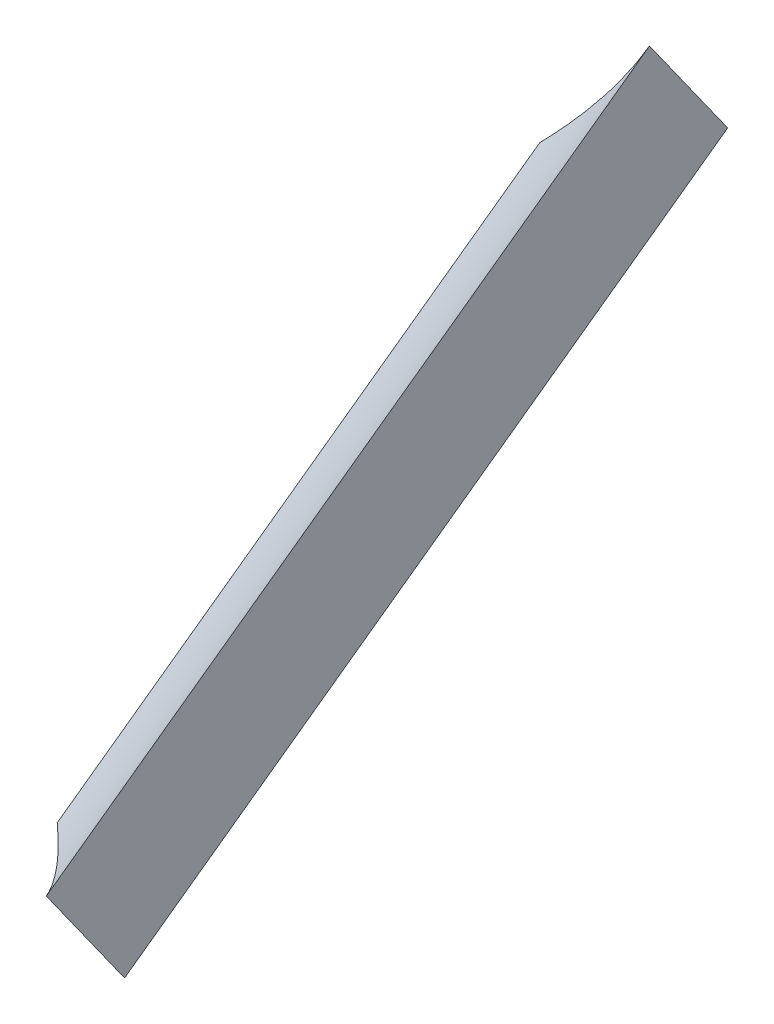
ISO-10303-21;
HEADER;
FILE_DESCRIPTION(('STEP AP214'),'2;1');
FILE_NAME('part.step','',(''),(''),'','','');
FILE_SCHEMA(('AUTOMOTIVE_DESIGN { 1 0 10303 214 1 1 1 1 }'));
ENDSEC;
DATA;
#1=APPLICATION_CONTEXT('core data for automotive mechanical design processes');
#2=APPLICATION_PROTOCOL_DEFINITION('international standard','automotive_design',2000,#1);
#3=PRODUCT_CONTEXT('',#1,'mechanical');
#4=PRODUCT('Part','Part','',(#3));
#5=PRODUCT_RELATED_PRODUCT_CATEGORY('part','',(#4));
#6=PRODUCT_DEFINITION_FORMATION('','',#4);
#7=PRODUCT_DEFINITION_CONTEXT('part definition',#1,'design');
#8=PRODUCT_DEFINITION('design','',#6,#7);
#9=PRODUCT_DEFINITION_SHAPE('','',#8);
#10=(LENGTH_UNIT() NAMED_UNIT(*) SI_UNIT(.MILLI.,.METRE.));
#11=(NAMED_UNIT(*) PLANE_ANGLE_UNIT() SI_UNIT($,.RADIAN.));
#12=(NAMED_UNIT(*) SI_UNIT($,.STERADIAN.) SOLID_ANGLE_UNIT());
#13=UNCERTAINTY_MEASURE_WITH_UNIT(LENGTH_MEASURE(1.E-05),#10,'distance_accuracy_value','');
#14=(GEOMETRIC_REPRESENTATION_CONTEXT(3) GLOBAL_UNCERTAINTY_ASSIGNED_CONTEXT((#13)) GLOBAL_UNIT_ASSIGNED_CONTEXT((#10,
#11,#12)) REPRESENTATION_CONTEXT('',''));
#15=CARTESIAN_POINT('',(0.,0.,0.));
#16=DIRECTION('',(0.,0.,1.));
#17=DIRECTION('',(1.,0.,0.));
#18=AXIS2_PLACEMENT_3D('',#15,#16,#17);
#19=CARTESIAN_POINT('',(-0.339763569299086,18.724821685513,-56.1997577382998));
#20=DIRECTION('',(-0.0335411656828547,0.819152044288991,0.572594899158037));
#21=DIRECTION('',(-0.999381574619397,-0.0335411656828547,-0.0105573915287128));
#22=AXIS2_PLACEMENT_3D('',#19,#20,#21);
#23=PLANE('',#22);
#24=DIRECTION('',(0.0105573915287129,-0.572594899158037,0.819770469669594));
#25=VECTOR('',#24,1.);
#26=CARTESIAN_POINT('',(-25.4671759207681,17.8814974515406,-56.4652018259586));
#27=LINE('',#26,#25);
#28=CARTESIAN_POINT('',(-25.3331962849919,10.6149244701491,-46.061822482896));
#29=VERTEX_POINT('',#28);
#30=CARTESIAN_POINT('',(-25.284433810683,7.97022345819113,-42.2754670789334));
#31=VERTEX_POINT('',#30);
#32=EDGE_CURVE('E40',#29,#31,#27,.T.);
#33=ORIENTED_EDGE('',*,*,#32,.F.);
#34=DIRECTION('',(0.860211135930134,0.315344951132914,-0.400742265573234));
#35=VECTOR('',#34,1.);
#36=CARTESIAN_POINT('',(-24.3399100232136,10.9790534549974,-46.5245597927047));
#37=LINE('',#36,#35);
#38=CARTESIAN_POINT('',(-24.3399100232136,10.9790534549974,-46.5245597927047));
#39=VERTEX_POINT('',#38);
#40=EDGE_CURVE('E104',#29,#39,#37,.T.);
#41=ORIENTED_EDGE('',*,*,#40,.T.);
#42=DIRECTION('',(-0.0105573915287128,0.572594899158037,-0.819770469669595));
#43=VECTOR('',#42,1.);
#44=CARTESIAN_POINT('',(-24.2789569232225,7.67317680470848,-41.7916149860673));
#45=LINE('',#44,#43);
#46=CARTESIAN_POINT('',(-24.2789569232225,7.67317680470848,-41.7916149860673));
#47=VERTEX_POINT('',#46);
#48=EDGE_CURVE('E66',#47,#39,#45,.T.);
#49=ORIENTED_EDGE('',*,*,#48,.F.);
#50=DIRECTION('',(-0.870768527458847,0.257249948025123,-0.419028204096362));
#51=VECTOR('',#50,1.);
#52=CARTESIAN_POINT('',(-19.2515748299389,6.18794422978543,-39.3723556497169));
#53=LINE('',#52,#51);
#54=EDGE_CURVE('E69',#47,#31,#53,.T.);
#55=ORIENTED_EDGE('',*,*,#54,.T.);
#56=EDGE_LOOP('',(#33,#41,#49,#55));
#57=FACE_BOUND('',#56,.T.);
#58=ADVANCED_FACE('F33',(#57),#23,.F.);
#59=CARTESIAN_POINT('',(-28.2714995342203,13.6041230774998,-41.9690074191753));
#60=DIRECTION('',(0.508833756571127,-0.47911114590689,0.715220747770576));
#61=DIRECTION('',(0.814830294525395,0.,-0.579699569711465));
#62=AXIS2_PLACEMENT_3D('',#59,#60,#61);
#63=PLANE('',#62);
#64=DIRECTION('',(-0.0335411656828549,0.819152044288991,0.572594899158037));
#65=VECTOR('',#64,1.);
#66=CARTESIAN_POINT('',(-24.3399100232136,10.9790534549974,-46.5245597927047));
#67=LINE('',#66,#65);
#68=CARTESIAN_POINT('',(-24.3734511888964,11.7982054992864,-45.9519648935466));
#69=VERTEX_POINT('',#68);
#70=EDGE_CURVE('E103',#39,#69,#67,.T.);
#71=ORIENTED_EDGE('',*,*,#70,.F.);
#72=ORIENTED_EDGE('',*,*,#40,.F.);
#73=CARTESIAN_POINT('',(-24.3734511888964,11.7982054992864,-45.9519648935466));
#74=CARTESIAN_POINT('',(-24.443429620325,11.6929031639885,-45.9727195129208));
#75=CARTESIAN_POINT('',(-24.5162053834791,11.5889164161265,-45.9906027259206));
#76=CARTESIAN_POINT('',(-24.6670346096946,11.3839800992247,-46.0205798650341));
#77=CARTESIAN_POINT('',(-24.745088072756,11.283030530185,-46.0326737911478));
#78=CARTESIAN_POINT('',(-24.9854562356764,10.9868662184835,-46.0600614019214));
#79=CARTESIAN_POINT('',(-25.1550606799734,10.7967111928932,-46.0667795035742));
#80=CARTESIAN_POINT('',(-25.3331962849919,10.6149244701492,-46.0618224828961));
#81=B_SPLINE_CURVE_WITH_KNOTS('',3,(#73,#74,#75,#76,#77,#78,#79,#80),.UNSPECIFIED.,.F.,.F.,(4,2,
2,4),(0.,0.384273336740766,0.768546673481488,1.53120841465478),.UNSPECIFIED.);
#82=EDGE_CURVE('E79',#69,#29,#81,.T.);
#83=ORIENTED_EDGE('',*,*,#82,.F.);
#84=EDGE_LOOP('',(#71,#72,#83));
#85=FACE_BOUND('',#84,.T.);
#86=ADVANCED_FACE('F85',(#85),#63,.F.);
#87=CARTESIAN_POINT('',(-24.2789569232225,7.67317680470848,-41.7916149860673));
#88=DIRECTION('',(0.999381574619397,0.0335411656828548,0.0105573915287128));
#89=DIRECTION('',(0.0105573915287128,-0.572594899158037,0.819770469669595));
#90=AXIS2_PLACEMENT_3D('',#87,#88,#89);
#91=PLANE('',#90);
#92=DIRECTION('',(0.0105573915287128,-0.572594899158037,0.819770469669595));
#93=VECTOR('',#92,1.);
#94=CARTESIAN_POINT('',(-24.3124980889054,8.49232884899748,-41.2190200869092));
#95=LINE('',#94,#93);
#96=CARTESIAN_POINT('',(-24.3124980889054,8.49232884899747,-41.2190200869092));
#97=VERTEX_POINT('',#96);
#98=EDGE_CURVE('E46',#97,#69,#95,.F.);
#99=ORIENTED_EDGE('',*,*,#98,.F.);
#100=DIRECTION('',(-0.0335411656828549,0.819152044288991,0.572594899158037));
#101=VECTOR('',#100,1.);
#102=CARTESIAN_POINT('',(-24.2789569232225,7.67317680470848,-41.7916149860673));
#103=LINE('',#102,#101);
#104=EDGE_CURVE('E73',#47,#97,#103,.T.);
#105=ORIENTED_EDGE('',*,*,#104,.F.);
#106=ORIENTED_EDGE('',*,*,#48,.T.);
#107=ORIENTED_EDGE('',*,*,#70,.T.);
#108=EDGE_LOOP('',(#99,#105,#106,#107));
#109=FACE_BOUND('',#108,.T.);
#110=ADVANCED_FACE('F90',(#109),#91,.T.);
#111=CARTESIAN_POINT('',(-28.256785666044,12.8060958525104,-40.8264908616552));
#112=DIRECTION('',(-0.490547818048128,-0.512652311589684,0.704663356241811));
#113=DIRECTION('',(0.,-0.808643347571763,-0.588299189552334));
#114=AXIS2_PLACEMENT_3D('',#111,#112,#113);
#115=PLANE('',#114);
#116=ORIENTED_EDGE('',*,*,#104,.T.);
#117=CARTESIAN_POINT('',(-25.284433810683,7.97022345819113,-42.2754670789334));
#118=CARTESIAN_POINT('',(-25.1936550379623,8.00047891813767,-42.1902606327188));
#119=CARTESIAN_POINT('',(-25.105029827525,8.03421277123022,-42.104022798961));
#120=CARTESIAN_POINT('',(-24.9324234455828,8.1084710829495,-41.9298397963778));
#121=CARTESIAN_POINT('',(-24.8484422740781,8.14899554157623,-41.8418946275525));
#122=CARTESIAN_POINT('',(-24.6052181741543,8.27983422039897,-41.5773884615838));
#123=CARTESIAN_POINT('',(-24.4532946987239,8.37988295582181,-41.3988408703768));
#124=CARTESIAN_POINT('',(-24.3124980889054,8.49232884899747,-41.2190200869092));
#125=B_SPLINE_CURVE_WITH_KNOTS('',3,(#117,#118,#119,#120,#121,#122,#123,#124),.UNSPECIFIED.,.F.,
.F.,(4,2,2,4),(0.,0.384273336740762,0.768546673481495,1.53120841465485),.UNSPECIFIED.);
#126=EDGE_CURVE('E11',#31,#97,#125,.T.);
#127=ORIENTED_EDGE('',*,*,#126,.F.);
#128=ORIENTED_EDGE('',*,*,#54,.F.);
#129=EDGE_LOOP('',(#116,#127,#128));
#130=FACE_BOUND('',#129,.T.);
#131=ADVANCED_FACE('F75',(#130),#115,.T.);
#132=CARTESIAN_POINT('',(-25.284433810683,7.97022345819113,-42.2754670789334));
#133=CARTESIAN_POINT('',(-25.2864655804459,8.08041933368938,-42.4332318874319));
#134=CARTESIAN_POINT('',(-25.2897164126348,8.25673276531387,-42.6856556251641));
#135=CARTESIAN_POINT('',(-25.2937799521606,8.47712451631037,-43.001185242161));
#136=CARTESIAN_POINT('',(-25.2966244302075,8.63139876255944,-43.2220560034819));
#137=CARTESIAN_POINT('',(-25.2987916507195,8.74894099893029,-43.3903384217455));
#138=CARTESIAN_POINT('',(-25.3008234204824,8.85913687442855,-43.548103230244));
#139=CARTESIAN_POINT('',(-25.3024488361032,8.94729356455138,-43.6743150623312));
#140=CARTESIAN_POINT('',(-25.3051578624537,9.09422139854905,-43.8846681403291));
#141=CARTESIAN_POINT('',(-25.3088150478374,9.29257396417012,-44.1686447809147));
#142=CARTESIAN_POINT('',(-25.3124722332212,9.49092652979122,-44.4526214215004));
#143=CARTESIAN_POINT('',(-25.3151812595717,9.6378543637889,-44.6629744994983));
#144=CARTESIAN_POINT('',(-25.3168066751925,9.72601105391173,-44.7891863315855));
#145=CARTESIAN_POINT('',(-25.3188384449554,9.83620692940998,-44.9469511400839));
#146=CARTESIAN_POINT('',(-25.3210056654674,9.9537491657808,-45.1152335583475));
#147=CARTESIAN_POINT('',(-25.3238501435143,10.1080234120299,-45.3361043196685));
#148=CARTESIAN_POINT('',(-25.3279136830401,10.3284151630264,-45.6516339366654));
#149=CARTESIAN_POINT('',(-25.331164515229,10.5047285946509,-45.9040576743977));
#150=CARTESIAN_POINT('',(-25.3331962849919,10.6149244701492,-46.0618224828961));
#151=CARTESIAN_POINT('',(-24.921631657512,8.0911768231885,-41.9349089604277));
#152=CARTESIAN_POINT('',(-24.9200821656428,8.21675578673761,-42.1121928975974));
#153=CARTESIAN_POINT('',(-24.9176004893182,8.41815372378916,-42.3965151212947));
#154=CARTESIAN_POINT('',(-24.9221132172485,8.65675479549133,-42.7381881040393));
#155=CARTESIAN_POINT('',(-24.9260653602677,8.82230015258575,-42.9757785543021));
#156=CARTESIAN_POINT('',(-24.9285298813801,8.94940614330444,-43.1578315583639));
#157=CARTESIAN_POINT('',(-24.9306333874848,9.06896002790884,-43.3289286833899));
#158=CARTESIAN_POINT('',(-24.9322726216102,9.16470057049625,-43.4659164804099));
#159=CARTESIAN_POINT('',(-24.9351351599442,9.3240551211976,-43.6940115972353));
#160=CARTESIAN_POINT('',(-24.9392295980038,9.53874137335546,-44.0014609781162));
#161=CARTESIAN_POINT('',(-24.94305340213,9.75351206361983,-44.3088548658533));
#162=CARTESIAN_POINT('',(-24.9460662942601,9.91281970375945,-44.5369808125333));
#163=CARTESIAN_POINT('',(-24.9479561090264,10.0084820648913,-44.6740199907951));
#164=CARTESIAN_POINT('',(-24.9502600715417,10.1279734068591,-44.8451582191533));
#165=CARTESIAN_POINT('',(-24.9524840444578,10.2551544488988,-45.0271618991133));
#166=CARTESIAN_POINT('',(-24.954646780331,10.4212581031336,-45.264385433716));
#167=CARTESIAN_POINT('',(-24.9589339089476,10.6599295620878,-45.6060121576083));
#168=CARTESIAN_POINT('',(-24.9687713885777,10.8574839079494,-45.8928604085701));
#169=CARTESIAN_POINT('',(-24.9749074685004,10.9806649640332,-46.0717202624635));
#170=CARTESIAN_POINT('',(-24.5957991289428,8.26620786264337,-41.5807448043032));
#171=CARTESIAN_POINT('',(-24.5942931659696,8.40130652559037,-41.7714152882646));
#172=CARTESIAN_POINT('',(-24.5918832565484,8.618071715994,-42.0773496124166));
#173=CARTESIAN_POINT('',(-24.596738239365,8.87502532217785,-42.4453046019552));
#174=CARTESIAN_POINT('',(-24.6009561629314,9.05331888715247,-42.7012028367072));
#175=CARTESIAN_POINT('',(-24.6036051432115,9.1902052164152,-42.8972657107842));
#176=CARTESIAN_POINT('',(-24.6058747351864,9.31895371887003,-43.0815202240267));
#177=CARTESIAN_POINT('',(-24.6076453995507,9.4220559716836,-43.229039697031));
#178=CARTESIAN_POINT('',(-24.610731316208,9.59366580769888,-43.4746756681214));
#179=CARTESIAN_POINT('',(-24.6151349324727,9.82486868603519,-43.8057800510654));
#180=CARTESIAN_POINT('',(-24.6192587678613,10.0561640778658,-44.1368234181513));
#181=CARTESIAN_POINT('',(-24.6225001200039,10.2277225169447,-44.3824932873038));
#182=CARTESIAN_POINT('',(-24.6245298341864,10.3307391112808,-44.530069255045));
#183=CARTESIAN_POINT('',(-24.6270066576398,10.4594190897233,-44.7143689622502));
#184=CARTESIAN_POINT('',(-24.629406959625,10.596387647973,-44.9103776034583));
#185=CARTESIAN_POINT('',(-24.6317749972863,10.7752929038233,-45.1658724068624));
#186=CARTESIAN_POINT('',(-24.6363967559363,11.0323236288686,-45.5337765338372));
#187=CARTESIAN_POINT('',(-24.6467223678935,11.2448776394347,-45.8424882771487));
#188=CARTESIAN_POINT('',(-24.6531617352839,11.3773490667912,-46.0348915141027));
#189=CARTESIAN_POINT('',(-24.3124980889054,8.49232884899747,-41.2190200869092));
#190=CARTESIAN_POINT('',(-24.315037801405,8.63007370942618,-41.4162261205191));
#191=CARTESIAN_POINT('',(-24.3191013421149,8.85046552464626,-41.7317558294634));
#192=CARTESIAN_POINT('',(-24.3241807671142,9.12595524550367,-42.1261678966832));
#193=CARTESIAN_POINT('',(-24.3277363650873,9.3187980757933,-42.402256380516));
#194=CARTESIAN_POINT('',(-24.3304453910431,9.4657258883831,-42.6126094278648));
#195=CARTESIAN_POINT('',(-24.3329851035427,9.6034707488118,-42.8098154614746));
#196=CARTESIAN_POINT('',(-24.3350168733056,9.71366662431006,-42.9675802699731));
#197=CARTESIAN_POINT('',(-24.3384031566384,9.897326438215,-43.2305216481196));
#198=CARTESIAN_POINT('',(-24.3429746389009,10.145267174142,-43.585492490228));
#199=CARTESIAN_POINT('',(-24.3475461211634,10.3932079100689,-43.9404633323363));
#200=CARTESIAN_POINT('',(-24.3509324044962,10.5768677239739,-44.2034047104828));
#201=CARTESIAN_POINT('',(-24.3529641742591,10.6870635994721,-44.3611695189813));
#202=CARTESIAN_POINT('',(-24.3555038867587,10.8248084599008,-44.5583755525912));
#203=CARTESIAN_POINT('',(-24.3582129127145,10.9717362724907,-44.76872859994));
#204=CARTESIAN_POINT('',(-24.3617685106877,11.1645791027802,-45.0448170837728));
#205=CARTESIAN_POINT('',(-24.3668479356869,11.4400688236377,-45.4392291509925));
#206=CARTESIAN_POINT('',(-24.3709114763968,11.6604606388577,-45.7547588599367));
#207=CARTESIAN_POINT('',(-24.3734511888964,11.7982054992864,-45.9519648935466));
#208=(BOUNDED_SURFACE() B_SPLINE_SURFACE(3,3,((#132,#133,#134,#135,#136,#137,#138,#139,#140,
#141,#142,#143,#144,#145,#146,#147,#148,#149,#150),(#151,#152,#153,#154,#155,#156,#157,#158,
#159,#160,#161,#162,#163,#164,#165,#166,#167,#168,#169),(#170,#171,#172,#173,#174,#175,#176,
#177,#178,#179,#180,#181,#182,#183,#184,#185,#186,#187,#188),(#189,#190,#191,#192,#193,#194,
#195,#196,#197,#198,#199,#200,#201,#202,#203,#204,#205,#206,#207)),.UNSPECIFIED.,.F.,.F.,
.F.) B_SPLINE_SURFACE_WITH_KNOTS((4,4),(4,1,1,1,1,1,1,1,1,1,1,1,1,1,1,1,4),(0.,1.),(0.,0.125,
0.200000034968739,0.249999999999997,0.300000023312486,0.333333333333333,0.374999999999999,
0.400000011656233,0.5,0.599999988343728,0.624999999999999,0.666666666666667,0.699999976687476,
0.75,0.799999965031221,0.875,1.),
.UNSPECIFIED.) GEOMETRIC_REPRESENTATION_ITEM() RATIONAL_B_SPLINE_SURFACE(((1.,1.,1.,1.,1.,1.,1.,
1.,1.,1.,1.,1.,1.,1.,1.,1.,1.,1.,1.),(0.994310099573258,0.994310099573258,0.993204740851224,
0.993224961069429,0.993385372831095,0.993406940773267,0.993388967460713,0.993366500826568,
0.9933530208487,0.993377284812321,0.993353020848701,0.993366500826569,0.993388967460713,
0.993406940773266,0.993385372831094,0.993224961069429,0.993204740851226,0.994310099573256,
0.994310099573256),(0.994310099573258,0.994310099573258,0.993204740851224,0.993224961069429,
0.993385372831095,0.993406940773267,0.993388967460713,0.993366500826568,0.9933530208487,
0.993377284812321,0.993353020848701,0.993366500826569,0.993388967460713,0.993406940773266,
0.993385372831094,0.993224961069429,0.993204740851226,0.994310099573256,0.994310099573256),(1.,
1.,1.,1.,1.,1.,1.,1.,1.,1.,1.,1.,1.,1.,1.,1.,1.,1.,1.))) REPRESENTATION_ITEM('') SURFACE());
#209=ORIENTED_EDGE('',*,*,#126,.T.);
#210=ORIENTED_EDGE('',*,*,#98,.T.);
#211=ORIENTED_EDGE('',*,*,#82,.T.);
#212=ORIENTED_EDGE('',*,*,#32,.T.);
#213=EDGE_LOOP('',(#209,#210,#211,#212));
#214=FACE_BOUND('',#213,.T.);
#215=ADVANCED_FACE('F35',(#214),#208,.T.);
#216=CLOSED_SHELL('',(#58,#86,#110,#131,#215));
#217=MANIFOLD_SOLID_BREP('B2',#216);
#218=ADVANCED_BREP_SHAPE_REPRESENTATION('',(#18,#217),#14);
#219=SHAPE_DEFINITION_REPRESENTATION(#9,#218);
ENDSEC;
END-ISO-10303-21;
